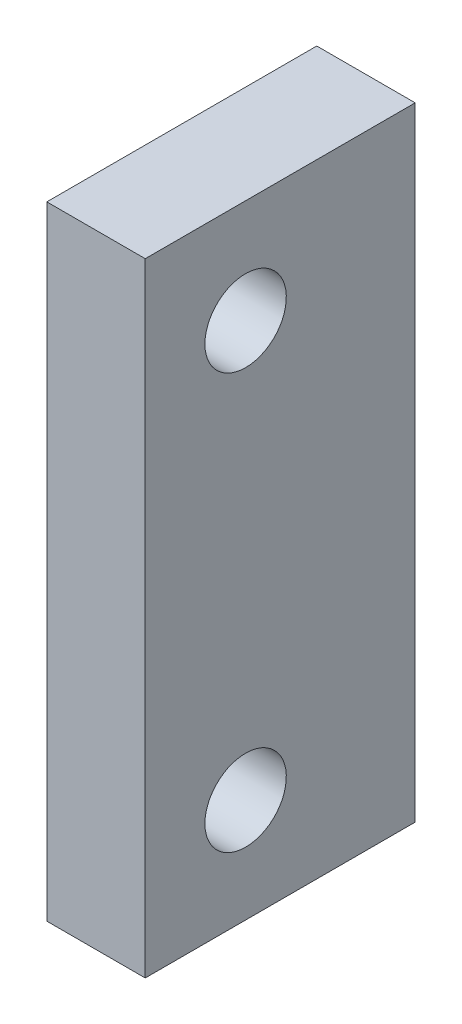
ISO-10303-21;
HEADER;
FILE_DESCRIPTION(('STEP AP214'),'2;1');
FILE_NAME('part.step','',(''),(''),'','','');
FILE_SCHEMA(('AUTOMOTIVE_DESIGN { 1 0 10303 214 1 1 1 1 }'));
ENDSEC;
DATA;
#1=APPLICATION_CONTEXT('core data for automotive mechanical design processes');
#2=APPLICATION_PROTOCOL_DEFINITION('international standard','automotive_design',2000,#1);
#3=PRODUCT_CONTEXT('',#1,'mechanical');
#4=PRODUCT('Part','Part','',(#3));
#5=PRODUCT_RELATED_PRODUCT_CATEGORY('part','',(#4));
#6=PRODUCT_DEFINITION_FORMATION('','',#4);
#7=PRODUCT_DEFINITION_CONTEXT('part definition',#1,'design');
#8=PRODUCT_DEFINITION('design','',#6,#7);
#9=PRODUCT_DEFINITION_SHAPE('','',#8);
#10=(LENGTH_UNIT() NAMED_UNIT(*) SI_UNIT(.MILLI.,.METRE.));
#11=(NAMED_UNIT(*) PLANE_ANGLE_UNIT() SI_UNIT($,.RADIAN.));
#12=(NAMED_UNIT(*) SI_UNIT($,.STERADIAN.) SOLID_ANGLE_UNIT());
#13=UNCERTAINTY_MEASURE_WITH_UNIT(LENGTH_MEASURE(1.E-05),#10,'distance_accuracy_value','');
#14=(GEOMETRIC_REPRESENTATION_CONTEXT(3) GLOBAL_UNCERTAINTY_ASSIGNED_CONTEXT((#13)) GLOBAL_UNIT_ASSIGNED_CONTEXT((#10,
#11,#12)) REPRESENTATION_CONTEXT('',''));
#15=CARTESIAN_POINT('',(0.,0.,0.));
#16=DIRECTION('',(0.,0.,1.));
#17=DIRECTION('',(1.,0.,0.));
#18=AXIS2_PLACEMENT_3D('',#15,#16,#17);
#19=CARTESIAN_POINT('',(-482.945633296058,166.583779805431,-178.477330938672));
#20=DIRECTION('',(0.,0.,-1.));
#21=DIRECTION('',(-1.,0.,0.));
#22=AXIS2_PLACEMENT_3D('',#19,#20,#21);
#23=PLANE('',#22);
#24=DIRECTION('',(0.,-1.,0.));
#25=VECTOR('',#24,1.);
#26=CARTESIAN_POINT('',(-488.965433296058,166.583779805431,-178.477330938672));
#27=LINE('',#26,#25);
#28=CARTESIAN_POINT('',(-488.965433296058,166.583779805431,-178.477330938672));
#29=VERTEX_POINT('',#28);
#30=CARTESIAN_POINT('',(-488.965433296058,128.483779805431,-178.477330938672));
#31=VERTEX_POINT('',#30);
#32=EDGE_CURVE('E102',#29,#31,#27,.T.);
#33=ORIENTED_EDGE('',*,*,#32,.T.);
#34=DIRECTION('',(-1.,0.,0.));
#35=VECTOR('',#34,1.);
#36=CARTESIAN_POINT('',(-482.945633296058,128.483779805431,-178.477330938672));
#37=LINE('',#36,#35);
#38=CARTESIAN_POINT('',(-482.945633296058,128.483779805431,-178.477330938672));
#39=VERTEX_POINT('',#38);
#40=EDGE_CURVE('E11',#39,#31,#37,.T.);
#41=ORIENTED_EDGE('',*,*,#40,.F.);
#42=DIRECTION('',(0.,-1.,0.));
#43=VECTOR('',#42,1.);
#44=CARTESIAN_POINT('',(-482.945633296058,166.583779805431,-178.477330938672));
#45=LINE('',#44,#43);
#46=CARTESIAN_POINT('',(-482.945633296058,166.583779805431,-178.477330938672));
#47=VERTEX_POINT('',#46);
#48=EDGE_CURVE('E89',#47,#39,#45,.T.);
#49=ORIENTED_EDGE('',*,*,#48,.F.);
#50=DIRECTION('',(-1.,0.,0.));
#51=VECTOR('',#50,1.);
#52=CARTESIAN_POINT('',(-482.945633296058,166.583779805431,-178.477330938672));
#53=LINE('',#52,#51);
#54=EDGE_CURVE('E98',#47,#29,#53,.T.);
#55=ORIENTED_EDGE('',*,*,#54,.T.);
#56=EDGE_LOOP('',(#33,#41,#49,#55));
#57=FACE_BOUND('',#56,.T.);
#58=ADVANCED_FACE('F37',(#57),#23,.F.);
#59=CARTESIAN_POINT('',(-482.945633296058,128.483779805431,-194.987330938672));
#60=DIRECTION('',(0.,1.,0.));
#61=DIRECTION('',(-1.,0.,0.));
#62=AXIS2_PLACEMENT_3D('',#59,#60,#61);
#63=PLANE('',#62);
#64=DIRECTION('',(0.,0.,-1.));
#65=VECTOR('',#64,1.);
#66=CARTESIAN_POINT('',(-488.965433296058,128.483779805431,-194.987330938672));
#67=LINE('',#66,#65);
#68=CARTESIAN_POINT('',(-488.965433296058,128.483779805431,-194.987330938672));
#69=VERTEX_POINT('',#68);
#70=EDGE_CURVE('E93',#31,#69,#67,.T.);
#71=ORIENTED_EDGE('',*,*,#70,.T.);
#72=DIRECTION('',(-1.,0.,0.));
#73=VECTOR('',#72,1.);
#74=CARTESIAN_POINT('',(-482.945633296058,128.483779805431,-194.987330938672));
#75=LINE('',#74,#73);
#76=CARTESIAN_POINT('',(-482.945633296058,128.483779805431,-194.987330938672));
#77=VERTEX_POINT('',#76);
#78=EDGE_CURVE('E46',#77,#69,#75,.T.);
#79=ORIENTED_EDGE('',*,*,#78,.F.);
#80=DIRECTION('',(0.,0.,-1.));
#81=VECTOR('',#80,1.);
#82=CARTESIAN_POINT('',(-482.945633296058,128.483779805431,-194.987330938672));
#83=LINE('',#82,#81);
#84=EDGE_CURVE('E84',#39,#77,#83,.T.);
#85=ORIENTED_EDGE('',*,*,#84,.F.);
#86=ORIENTED_EDGE('',*,*,#40,.T.);
#87=EDGE_LOOP('',(#71,#79,#85,#86));
#88=FACE_BOUND('',#87,.T.);
#89=ADVANCED_FACE('F92',(#88),#63,.F.);
#90=CARTESIAN_POINT('',(-482.945633296058,128.483779805431,-194.987330938672));
#91=DIRECTION('',(0.,0.,1.));
#92=DIRECTION('',(1.,0.,0.));
#93=AXIS2_PLACEMENT_3D('',#90,#91,#92);
#94=PLANE('',#93);
#95=DIRECTION('',(0.,1.,0.));
#96=VECTOR('',#95,1.);
#97=CARTESIAN_POINT('',(-488.965433296058,128.483779805431,-194.987330938672));
#98=LINE('',#97,#96);
#99=CARTESIAN_POINT('',(-488.965433296058,166.583779805426,-194.987330938672));
#100=VERTEX_POINT('',#99);
#101=EDGE_CURVE('E71',#69,#100,#98,.T.);
#102=ORIENTED_EDGE('',*,*,#101,.T.);
#103=DIRECTION('',(-1.,0.,0.));
#104=VECTOR('',#103,1.);
#105=CARTESIAN_POINT('',(-482.945633296058,166.583779805426,-194.987330938672));
#106=LINE('',#105,#104);
#107=CARTESIAN_POINT('',(-482.945633296058,166.583779805426,-194.987330938672));
#108=VERTEX_POINT('',#107);
#109=EDGE_CURVE('E94',#108,#100,#106,.T.);
#110=ORIENTED_EDGE('',*,*,#109,.F.);
#111=DIRECTION('',(0.,1.,0.));
#112=VECTOR('',#111,1.);
#113=CARTESIAN_POINT('',(-482.945633296058,128.483779805431,-194.987330938672));
#114=LINE('',#113,#112);
#115=EDGE_CURVE('E87',#77,#108,#114,.T.);
#116=ORIENTED_EDGE('',*,*,#115,.F.);
#117=ORIENTED_EDGE('',*,*,#78,.T.);
#118=EDGE_LOOP('',(#102,#110,#116,#117));
#119=FACE_BOUND('',#118,.T.);
#120=ADVANCED_FACE('F96',(#119),#94,.F.);
#121=CARTESIAN_POINT('',(-482.945633296058,166.583779805426,-194.987330938672));
#122=DIRECTION('',(0.,-1.,3.11010386971009E-13));
#123=DIRECTION('',(0.,-3.11010386971009E-13,-1.));
#124=AXIS2_PLACEMENT_3D('',#121,#122,#123);
#125=PLANE('',#124);
#126=DIRECTION('',(0.,3.11010386971008E-13,1.));
#127=VECTOR('',#126,1.);
#128=CARTESIAN_POINT('',(-488.965433296058,166.583779805426,-194.987330938672));
#129=LINE('',#128,#127);
#130=EDGE_CURVE('E77',#100,#29,#129,.T.);
#131=ORIENTED_EDGE('',*,*,#130,.T.);
#132=ORIENTED_EDGE('',*,*,#54,.F.);
#133=DIRECTION('',(0.,3.11010386971008E-13,1.));
#134=VECTOR('',#133,1.);
#135=CARTESIAN_POINT('',(-482.945633296058,166.583779805426,-194.987330938672));
#136=LINE('',#135,#134);
#137=EDGE_CURVE('E54',#108,#47,#136,.T.);
#138=ORIENTED_EDGE('',*,*,#137,.F.);
#139=ORIENTED_EDGE('',*,*,#109,.T.);
#140=EDGE_LOOP('',(#131,#132,#138,#139));
#141=FACE_BOUND('',#140,.T.);
#142=ADVANCED_FACE('F109',(#141),#125,.F.);
#143=CARTESIAN_POINT('',(-482.945633296056,-5.63589476550986E-12,0.));
#144=DIRECTION('',(-1.,0.,0.));
#145=DIRECTION('',(0.,-1.,0.));
#146=AXIS2_PLACEMENT_3D('',#143,#144,#145);
#147=PLANE('',#146);
#148=CARTESIAN_POINT('',(-482.945633296058,160.233779805426,-184.616110940738));
#149=DIRECTION('',(-1.,0.,0.));
#150=DIRECTION('',(0.,-1.,0.));
#151=AXIS2_PLACEMENT_3D('',#148,#149,#150);
#152=CIRCLE('',#151,2.4892);
#153=CARTESIAN_POINT('',(-482.945633296058,157.744579805426,-184.616110940738));
#154=VERTEX_POINT('',#153);
#155=EDGE_CURVE('E118',#154,#154,#152,.T.);
#156=ORIENTED_EDGE('',*,*,#155,.T.);
#157=EDGE_LOOP('',(#156));
#158=FACE_BOUND('',#157,.T.);
#159=CARTESIAN_POINT('',(-482.945633296058,134.833779805426,-184.616110940738));
#160=DIRECTION('',(-1.,0.,0.));
#161=DIRECTION('',(0.,-1.,0.));
#162=AXIS2_PLACEMENT_3D('',#159,#160,#161);
#163=CIRCLE('',#162,2.4892);
#164=CARTESIAN_POINT('',(-482.945633296058,132.344579805426,-184.616110940738));
#165=VERTEX_POINT('',#164);
#166=EDGE_CURVE('E40',#165,#165,#163,.T.);
#167=ORIENTED_EDGE('',*,*,#166,.T.);
#168=EDGE_LOOP('',(#167));
#169=FACE_BOUND('',#168,.T.);
#170=ORIENTED_EDGE('',*,*,#48,.T.);
#171=ORIENTED_EDGE('',*,*,#84,.T.);
#172=ORIENTED_EDGE('',*,*,#115,.T.);
#173=ORIENTED_EDGE('',*,*,#137,.T.);
#174=EDGE_LOOP('',(#170,#171,#172,#173));
#175=FACE_BOUND('',#174,.T.);
#176=ADVANCED_FACE('F85',(#158,#169,#175),#147,.F.);
#177=CARTESIAN_POINT('',(-488.965433296056,-5.69932474846298E-12,0.));
#178=DIRECTION('',(-1.,0.,0.));
#179=DIRECTION('',(0.,-1.,0.));
#180=AXIS2_PLACEMENT_3D('',#177,#178,#179);
#181=PLANE('',#180);
#182=CARTESIAN_POINT('',(-488.965433296058,160.233779805426,-184.616110940738));
#183=DIRECTION('',(-1.,0.,0.));
#184=DIRECTION('',(0.,0.,1.));
#185=AXIS2_PLACEMENT_3D('',#182,#183,#184);
#186=CIRCLE('',#185,2.4892);
#187=CARTESIAN_POINT('',(-488.965433296058,160.233779805426,-182.126910940738));
#188=VERTEX_POINT('',#187);
#189=EDGE_CURVE('E121',#188,#188,#186,.T.);
#190=ORIENTED_EDGE('',*,*,#189,.F.);
#191=EDGE_LOOP('',(#190));
#192=FACE_BOUND('',#191,.T.);
#193=CARTESIAN_POINT('',(-488.965433296058,134.833779805426,-184.616110940738));
#194=DIRECTION('',(-1.,0.,0.));
#195=DIRECTION('',(0.,0.,1.));
#196=AXIS2_PLACEMENT_3D('',#193,#194,#195);
#197=CIRCLE('',#196,2.4892);
#198=CARTESIAN_POINT('',(-488.965433296058,134.833779805426,-182.126910940738));
#199=VERTEX_POINT('',#198);
#200=EDGE_CURVE('E115',#199,#199,#197,.T.);
#201=ORIENTED_EDGE('',*,*,#200,.F.);
#202=EDGE_LOOP('',(#201));
#203=FACE_BOUND('',#202,.T.);
#204=ORIENTED_EDGE('',*,*,#32,.F.);
#205=ORIENTED_EDGE('',*,*,#130,.F.);
#206=ORIENTED_EDGE('',*,*,#101,.F.);
#207=ORIENTED_EDGE('',*,*,#70,.F.);
#208=EDGE_LOOP('',(#204,#205,#206,#207));
#209=FACE_BOUND('',#208,.T.);
#210=ADVANCED_FACE('F112',(#192,#203,#209),#181,.T.);
#211=CARTESIAN_POINT('',(-488.965433296058,134.833779805426,-184.616110940738));
#212=DIRECTION('',(-1.,0.,0.));
#213=DIRECTION('',(0.,0.,1.));
#214=AXIS2_PLACEMENT_3D('',#211,#212,#213);
#215=CYLINDRICAL_SURFACE('',#214,2.4892);
#216=ORIENTED_EDGE('',*,*,#200,.T.);
#217=EDGE_LOOP('',(#216));
#218=FACE_BOUND('',#217,.T.);
#219=ORIENTED_EDGE('',*,*,#166,.F.);
#220=EDGE_LOOP('',(#219));
#221=FACE_BOUND('',#220,.T.);
#222=ADVANCED_FACE('F130',(#218,#221),#215,.F.);
#223=CARTESIAN_POINT('',(-488.965433296058,160.233779805426,-184.616110940738));
#224=DIRECTION('',(-1.,0.,0.));
#225=DIRECTION('',(0.,0.,1.));
#226=AXIS2_PLACEMENT_3D('',#223,#224,#225);
#227=CYLINDRICAL_SURFACE('',#226,2.4892);
#228=ORIENTED_EDGE('',*,*,#189,.T.);
#229=EDGE_LOOP('',(#228));
#230=FACE_BOUND('',#229,.T.);
#231=ORIENTED_EDGE('',*,*,#155,.F.);
#232=EDGE_LOOP('',(#231));
#233=FACE_BOUND('',#232,.T.);
#234=ADVANCED_FACE('F125',(#230,#233),#227,.F.);
#235=CLOSED_SHELL('',(#58,#89,#120,#142,#176,#210,#222,#234));
#236=MANIFOLD_SOLID_BREP('B2',#235);
#237=ADVANCED_BREP_SHAPE_REPRESENTATION('',(#18,#236),#14);
#238=SHAPE_DEFINITION_REPRESENTATION(#9,#237);
ENDSEC;
END-ISO-10303-21;
